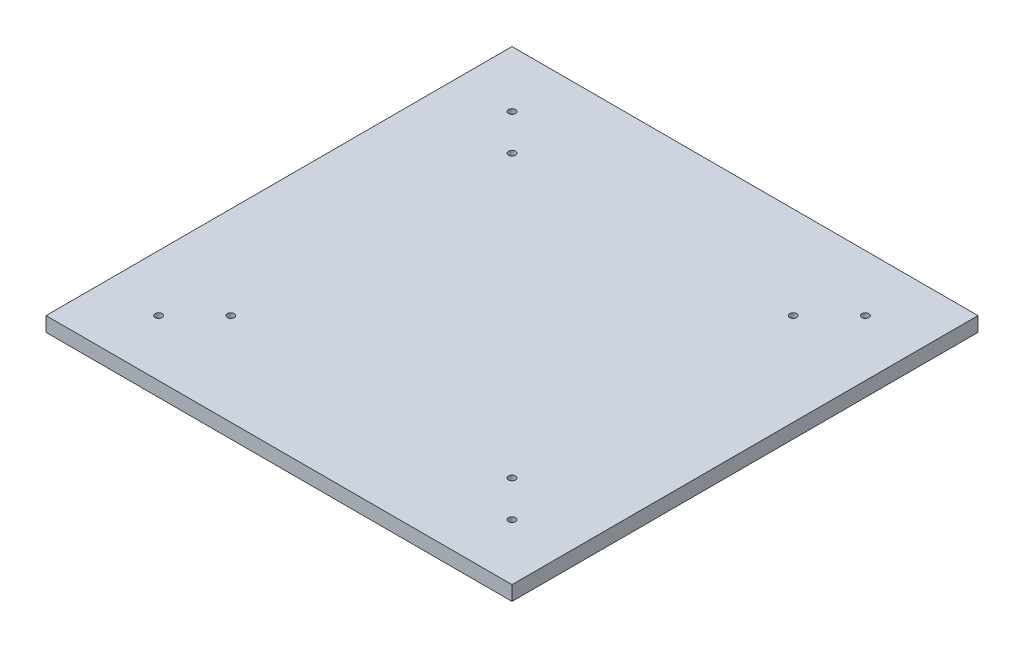
ISO-10303-21;
HEADER;
FILE_DESCRIPTION(('STEP AP214'),'2;1');
FILE_NAME('part.step','',(''),(''),'','','');
FILE_SCHEMA(('AUTOMOTIVE_DESIGN { 1 0 10303 214 1 1 1 1 }'));
ENDSEC;
DATA;
#1=APPLICATION_CONTEXT('core data for automotive mechanical design processes');
#2=APPLICATION_PROTOCOL_DEFINITION('international standard','automotive_design',2000,#1);
#3=PRODUCT_CONTEXT('',#1,'mechanical');
#4=PRODUCT('Part','Part','',(#3));
#5=PRODUCT_RELATED_PRODUCT_CATEGORY('part','',(#4));
#6=PRODUCT_DEFINITION_FORMATION('','',#4);
#7=PRODUCT_DEFINITION_CONTEXT('part definition',#1,'design');
#8=PRODUCT_DEFINITION('design','',#6,#7);
#9=PRODUCT_DEFINITION_SHAPE('','',#8);
#10=(LENGTH_UNIT() NAMED_UNIT(*) SI_UNIT(.MILLI.,.METRE.));
#11=(NAMED_UNIT(*) PLANE_ANGLE_UNIT() SI_UNIT($,.RADIAN.));
#12=(NAMED_UNIT(*) SI_UNIT($,.STERADIAN.) SOLID_ANGLE_UNIT());
#13=UNCERTAINTY_MEASURE_WITH_UNIT(LENGTH_MEASURE(1.E-05),#10,'distance_accuracy_value','');
#14=(GEOMETRIC_REPRESENTATION_CONTEXT(3) GLOBAL_UNCERTAINTY_ASSIGNED_CONTEXT((#13)) GLOBAL_UNIT_ASSIGNED_CONTEXT((#10,
#11,#12)) REPRESENTATION_CONTEXT('',''));
#15=CARTESIAN_POINT('',(0.,0.,0.));
#16=DIRECTION('',(0.,0.,1.));
#17=DIRECTION('',(1.,0.,0.));
#18=AXIS2_PLACEMENT_3D('',#15,#16,#17);
#19=CARTESIAN_POINT('',(0.,5.,0.));
#20=DIRECTION('',(0.,-1.,0.));
#21=DIRECTION('',(0.,0.,-1.));
#22=AXIS2_PLACEMENT_3D('',#19,#20,#21);
#23=PLANE('',#22);
#24=DIRECTION('',(0.,0.,-1.));
#25=VECTOR('',#24,1.);
#26=CARTESIAN_POINT('',(80.,5.,80.));
#27=LINE('',#26,#25);
#28=CARTESIAN_POINT('',(80.,5.,80.));
#29=VERTEX_POINT('',#28);
#30=CARTESIAN_POINT('',(80.,5.,-80.));
#31=VERTEX_POINT('',#30);
#32=EDGE_CURVE('E84',#29,#31,#27,.T.);
#33=ORIENTED_EDGE('',*,*,#32,.T.);
#34=DIRECTION('',(-1.,0.,0.));
#35=VECTOR('',#34,1.);
#36=CARTESIAN_POINT('',(-80.,5.,-80.));
#37=LINE('',#36,#35);
#38=CARTESIAN_POINT('',(-80.,5.,-80.));
#39=VERTEX_POINT('',#38);
#40=EDGE_CURVE('E79',#31,#39,#37,.T.);
#41=ORIENTED_EDGE('',*,*,#40,.T.);
#42=DIRECTION('',(0.,0.,1.));
#43=VECTOR('',#42,1.);
#44=CARTESIAN_POINT('',(-80.,5.,80.));
#45=LINE('',#44,#43);
#46=CARTESIAN_POINT('',(-80.,5.,80.));
#47=VERTEX_POINT('',#46);
#48=EDGE_CURVE('E82',#39,#47,#45,.T.);
#49=ORIENTED_EDGE('',*,*,#48,.T.);
#50=DIRECTION('',(1.,0.,0.));
#51=VECTOR('',#50,1.);
#52=CARTESIAN_POINT('',(-80.,5.,80.));
#53=LINE('',#52,#51);
#54=EDGE_CURVE('E49',#47,#29,#53,.T.);
#55=ORIENTED_EDGE('',*,*,#54,.T.);
#56=EDGE_LOOP('',(#33,#41,#49,#55));
#57=FACE_BOUND('',#56,.T.);
#58=CARTESIAN_POINT('',(-60.6642066420664,5.,-60.6642066420664));
#59=DIRECTION('',(0.,1.,0.));
#60=DIRECTION('',(0.,0.,1.));
#61=AXIS2_PLACEMENT_3D('',#58,#59,#60);
#62=CIRCLE('',#61,1.2);
#63=CARTESIAN_POINT('',(-60.6642066420664,5.,-59.4642066420664));
#64=VERTEX_POINT('',#63);
#65=EDGE_CURVE('E99',#64,#64,#62,.T.);
#66=ORIENTED_EDGE('',*,*,#65,.F.);
#67=EDGE_LOOP('',(#66));
#68=FACE_BOUND('',#67,.T.);
#69=CARTESIAN_POINT('',(-48.2795521345399,5.,-48.2795521345399));
#70=DIRECTION('',(0.,1.,0.));
#71=DIRECTION('',(0.,0.,1.));
#72=AXIS2_PLACEMENT_3D('',#69,#70,#71);
#73=CIRCLE('',#72,1.2);
#74=CARTESIAN_POINT('',(-48.2795521345399,5.,-47.0795521345399));
#75=VERTEX_POINT('',#74);
#76=EDGE_CURVE('E114',#75,#75,#73,.T.);
#77=ORIENTED_EDGE('',*,*,#76,.F.);
#78=EDGE_LOOP('',(#77));
#79=FACE_BOUND('',#78,.T.);
#80=CARTESIAN_POINT('',(48.2795521345399,5.,-48.2795521345399));
#81=DIRECTION('',(0.,1.,0.));
#82=DIRECTION('',(0.,0.,-1.));
#83=AXIS2_PLACEMENT_3D('',#80,#81,#82);
#84=CIRCLE('',#83,1.2);
#85=CARTESIAN_POINT('',(48.2795521345399,5.,-49.4795521345399));
#86=VERTEX_POINT('',#85);
#87=EDGE_CURVE('E120',#86,#86,#84,.T.);
#88=ORIENTED_EDGE('',*,*,#87,.F.);
#89=EDGE_LOOP('',(#88));
#90=FACE_BOUND('',#89,.T.);
#91=CARTESIAN_POINT('',(60.6642066420665,5.,-60.6642066420664));
#92=DIRECTION('',(0.,1.,0.));
#93=DIRECTION('',(0.,0.,-1.));
#94=AXIS2_PLACEMENT_3D('',#91,#92,#93);
#95=CIRCLE('',#94,1.2);
#96=CARTESIAN_POINT('',(60.6642066420665,5.,-61.8642066420664));
#97=VERTEX_POINT('',#96);
#98=EDGE_CURVE('E126',#97,#97,#95,.T.);
#99=ORIENTED_EDGE('',*,*,#98,.F.);
#100=EDGE_LOOP('',(#99));
#101=FACE_BOUND('',#100,.T.);
#102=CARTESIAN_POINT('',(60.6642066420665,5.,60.6642066420664));
#103=DIRECTION('',(0.,1.,0.));
#104=DIRECTION('',(0.,0.,1.));
#105=AXIS2_PLACEMENT_3D('',#102,#103,#104);
#106=CIRCLE('',#105,1.2);
#107=CARTESIAN_POINT('',(60.6642066420665,5.,61.8642066420664));
#108=VERTEX_POINT('',#107);
#109=EDGE_CURVE('E132',#108,#108,#106,.T.);
#110=ORIENTED_EDGE('',*,*,#109,.F.);
#111=EDGE_LOOP('',(#110));
#112=FACE_BOUND('',#111,.T.);
#113=CARTESIAN_POINT('',(48.2795521345399,5.,48.2795521345398));
#114=DIRECTION('',(0.,1.,0.));
#115=DIRECTION('',(0.,0.,1.));
#116=AXIS2_PLACEMENT_3D('',#113,#114,#115);
#117=CIRCLE('',#116,1.2);
#118=CARTESIAN_POINT('',(48.2795521345399,5.,49.4795521345398));
#119=VERTEX_POINT('',#118);
#120=EDGE_CURVE('E138',#119,#119,#117,.T.);
#121=ORIENTED_EDGE('',*,*,#120,.F.);
#122=EDGE_LOOP('',(#121));
#123=FACE_BOUND('',#122,.T.);
#124=CARTESIAN_POINT('',(-48.2795521345399,5.,48.2795521345399));
#125=DIRECTION('',(0.,1.,0.));
#126=DIRECTION('',(0.,0.,-1.));
#127=AXIS2_PLACEMENT_3D('',#124,#125,#126);
#128=CIRCLE('',#127,1.2);
#129=CARTESIAN_POINT('',(-48.2795521345399,5.,47.0795521345399));
#130=VERTEX_POINT('',#129);
#131=EDGE_CURVE('E144',#130,#130,#128,.T.);
#132=ORIENTED_EDGE('',*,*,#131,.F.);
#133=EDGE_LOOP('',(#132));
#134=FACE_BOUND('',#133,.T.);
#135=CARTESIAN_POINT('',(-60.6642066420664,5.,60.6642066420664));
#136=DIRECTION('',(0.,1.,0.));
#137=DIRECTION('',(0.,0.,-1.));
#138=AXIS2_PLACEMENT_3D('',#135,#136,#137);
#139=CIRCLE('',#138,1.2);
#140=CARTESIAN_POINT('',(-60.6642066420664,5.,59.4642066420664));
#141=VERTEX_POINT('',#140);
#142=EDGE_CURVE('E150',#141,#141,#139,.T.);
#143=ORIENTED_EDGE('',*,*,#142,.F.);
#144=EDGE_LOOP('',(#143));
#145=FACE_BOUND('',#144,.T.);
#146=ADVANCED_FACE('F32',(#57,#68,#79,#90,#101,#112,#123,#134,#145),#23,.F.);
#147=CARTESIAN_POINT('',(0.,0.,0.));
#148=DIRECTION('',(0.,-1.,0.));
#149=DIRECTION('',(0.,0.,-1.));
#150=AXIS2_PLACEMENT_3D('',#147,#148,#149);
#151=PLANE('',#150);
#152=CARTESIAN_POINT('',(-48.2795521345399,0.,48.2795521345399));
#153=DIRECTION('',(0.,1.,0.));
#154=DIRECTION('',(0.,0.,-1.));
#155=AXIS2_PLACEMENT_3D('',#152,#153,#154);
#156=CIRCLE('',#155,1.2);
#157=CARTESIAN_POINT('',(-48.2795521345399,0.,47.0795521345399));
#158=VERTEX_POINT('',#157);
#159=EDGE_CURVE('E147',#158,#158,#156,.T.);
#160=ORIENTED_EDGE('',*,*,#159,.T.);
#161=EDGE_LOOP('',(#160));
#162=FACE_BOUND('',#161,.T.);
#163=CARTESIAN_POINT('',(60.6642066420665,0.,60.6642066420664));
#164=DIRECTION('',(0.,1.,0.));
#165=DIRECTION('',(0.,0.,1.));
#166=AXIS2_PLACEMENT_3D('',#163,#164,#165);
#167=CIRCLE('',#166,1.2);
#168=CARTESIAN_POINT('',(60.6642066420665,0.,61.8642066420664));
#169=VERTEX_POINT('',#168);
#170=EDGE_CURVE('E135',#169,#169,#167,.T.);
#171=ORIENTED_EDGE('',*,*,#170,.T.);
#172=EDGE_LOOP('',(#171));
#173=FACE_BOUND('',#172,.T.);
#174=CARTESIAN_POINT('',(48.2795521345399,0.,-48.2795521345399));
#175=DIRECTION('',(0.,1.,0.));
#176=DIRECTION('',(0.,0.,-1.));
#177=AXIS2_PLACEMENT_3D('',#174,#175,#176);
#178=CIRCLE('',#177,1.2);
#179=CARTESIAN_POINT('',(48.2795521345399,0.,-49.4795521345399));
#180=VERTEX_POINT('',#179);
#181=EDGE_CURVE('E123',#180,#180,#178,.T.);
#182=ORIENTED_EDGE('',*,*,#181,.T.);
#183=EDGE_LOOP('',(#182));
#184=FACE_BOUND('',#183,.T.);
#185=CARTESIAN_POINT('',(-60.6642066420664,0.,-60.6642066420664));
#186=DIRECTION('',(0.,1.,0.));
#187=DIRECTION('',(0.,0.,1.));
#188=AXIS2_PLACEMENT_3D('',#185,#186,#187);
#189=CIRCLE('',#188,1.2);
#190=CARTESIAN_POINT('',(-60.6642066420664,0.,-59.4642066420664));
#191=VERTEX_POINT('',#190);
#192=EDGE_CURVE('E111',#191,#191,#189,.T.);
#193=ORIENTED_EDGE('',*,*,#192,.T.);
#194=EDGE_LOOP('',(#193));
#195=FACE_BOUND('',#194,.T.);
#196=DIRECTION('',(0.,0.,-1.));
#197=VECTOR('',#196,1.);
#198=CARTESIAN_POINT('',(80.,0.,80.));
#199=LINE('',#198,#197);
#200=CARTESIAN_POINT('',(80.,0.,80.));
#201=VERTEX_POINT('',#200);
#202=CARTESIAN_POINT('',(80.,0.,-80.));
#203=VERTEX_POINT('',#202);
#204=EDGE_CURVE('E96',#201,#203,#199,.T.);
#205=ORIENTED_EDGE('',*,*,#204,.F.);
#206=DIRECTION('',(1.,0.,0.));
#207=VECTOR('',#206,1.);
#208=CARTESIAN_POINT('',(-80.,0.,80.));
#209=LINE('',#208,#207);
#210=CARTESIAN_POINT('',(-80.,0.,80.));
#211=VERTEX_POINT('',#210);
#212=EDGE_CURVE('E72',#211,#201,#209,.T.);
#213=ORIENTED_EDGE('',*,*,#212,.F.);
#214=DIRECTION('',(0.,0.,1.));
#215=VECTOR('',#214,1.);
#216=CARTESIAN_POINT('',(-80.,0.,80.));
#217=LINE('',#216,#215);
#218=CARTESIAN_POINT('',(-80.,0.,-80.));
#219=VERTEX_POINT('',#218);
#220=EDGE_CURVE('E66',#219,#211,#217,.T.);
#221=ORIENTED_EDGE('',*,*,#220,.F.);
#222=DIRECTION('',(-1.,0.,0.));
#223=VECTOR('',#222,1.);
#224=CARTESIAN_POINT('',(-80.,0.,-80.));
#225=LINE('',#224,#223);
#226=EDGE_CURVE('E88',#203,#219,#225,.T.);
#227=ORIENTED_EDGE('',*,*,#226,.F.);
#228=EDGE_LOOP('',(#205,#213,#221,#227));
#229=FACE_BOUND('',#228,.T.);
#230=CARTESIAN_POINT('',(-48.2795521345399,0.,-48.2795521345399));
#231=DIRECTION('',(0.,1.,0.));
#232=DIRECTION('',(0.,0.,1.));
#233=AXIS2_PLACEMENT_3D('',#230,#231,#232);
#234=CIRCLE('',#233,1.2);
#235=CARTESIAN_POINT('',(-48.2795521345399,0.,-47.0795521345399));
#236=VERTEX_POINT('',#235);
#237=EDGE_CURVE('E117',#236,#236,#234,.T.);
#238=ORIENTED_EDGE('',*,*,#237,.T.);
#239=EDGE_LOOP('',(#238));
#240=FACE_BOUND('',#239,.T.);
#241=CARTESIAN_POINT('',(60.6642066420665,0.,-60.6642066420664));
#242=DIRECTION('',(0.,1.,0.));
#243=DIRECTION('',(0.,0.,-1.));
#244=AXIS2_PLACEMENT_3D('',#241,#242,#243);
#245=CIRCLE('',#244,1.2);
#246=CARTESIAN_POINT('',(60.6642066420665,0.,-61.8642066420664));
#247=VERTEX_POINT('',#246);
#248=EDGE_CURVE('E129',#247,#247,#245,.T.);
#249=ORIENTED_EDGE('',*,*,#248,.T.);
#250=EDGE_LOOP('',(#249));
#251=FACE_BOUND('',#250,.T.);
#252=CARTESIAN_POINT('',(48.2795521345399,0.,48.2795521345398));
#253=DIRECTION('',(0.,1.,0.));
#254=DIRECTION('',(0.,0.,1.));
#255=AXIS2_PLACEMENT_3D('',#252,#253,#254);
#256=CIRCLE('',#255,1.2);
#257=CARTESIAN_POINT('',(48.2795521345399,0.,49.4795521345398));
#258=VERTEX_POINT('',#257);
#259=EDGE_CURVE('E141',#258,#258,#256,.T.);
#260=ORIENTED_EDGE('',*,*,#259,.T.);
#261=EDGE_LOOP('',(#260));
#262=FACE_BOUND('',#261,.T.);
#263=CARTESIAN_POINT('',(-60.6642066420664,0.,60.6642066420664));
#264=DIRECTION('',(0.,1.,0.));
#265=DIRECTION('',(0.,0.,-1.));
#266=AXIS2_PLACEMENT_3D('',#263,#264,#265);
#267=CIRCLE('',#266,1.2);
#268=CARTESIAN_POINT('',(-60.6642066420664,0.,59.4642066420664));
#269=VERTEX_POINT('',#268);
#270=EDGE_CURVE('E153',#269,#269,#267,.T.);
#271=ORIENTED_EDGE('',*,*,#270,.T.);
#272=EDGE_LOOP('',(#271));
#273=FACE_BOUND('',#272,.T.);
#274=ADVANCED_FACE('F107',(#162,#173,#184,#195,#229,#240,#251,#262,#273),#151,.T.);
#275=CARTESIAN_POINT('',(80.,5.,80.));
#276=DIRECTION('',(-1.,0.,0.));
#277=DIRECTION('',(0.,0.,1.));
#278=AXIS2_PLACEMENT_3D('',#275,#276,#277);
#279=PLANE('',#278);
#280=ORIENTED_EDGE('',*,*,#204,.T.);
#281=DIRECTION('',(0.,-1.,0.));
#282=VECTOR('',#281,1.);
#283=CARTESIAN_POINT('',(80.,5.,-80.));
#284=LINE('',#283,#282);
#285=EDGE_CURVE('E11',#31,#203,#284,.T.);
#286=ORIENTED_EDGE('',*,*,#285,.F.);
#287=ORIENTED_EDGE('',*,*,#32,.F.);
#288=DIRECTION('',(0.,-1.,0.));
#289=VECTOR('',#288,1.);
#290=CARTESIAN_POINT('',(80.,5.,80.));
#291=LINE('',#290,#289);
#292=EDGE_CURVE('E92',#29,#201,#291,.T.);
#293=ORIENTED_EDGE('',*,*,#292,.T.);
#294=EDGE_LOOP('',(#280,#286,#287,#293));
#295=FACE_BOUND('',#294,.T.);
#296=ADVANCED_FACE('F34',(#295),#279,.F.);
#297=CARTESIAN_POINT('',(-80.,5.,-80.));
#298=DIRECTION('',(0.,0.,1.));
#299=DIRECTION('',(1.,0.,0.));
#300=AXIS2_PLACEMENT_3D('',#297,#298,#299);
#301=PLANE('',#300);
#302=ORIENTED_EDGE('',*,*,#226,.T.);
#303=DIRECTION('',(0.,-1.,0.));
#304=VECTOR('',#303,1.);
#305=CARTESIAN_POINT('',(-80.,5.,-80.));
#306=LINE('',#305,#304);
#307=EDGE_CURVE('E41',#39,#219,#306,.T.);
#308=ORIENTED_EDGE('',*,*,#307,.F.);
#309=ORIENTED_EDGE('',*,*,#40,.F.);
#310=ORIENTED_EDGE('',*,*,#285,.T.);
#311=EDGE_LOOP('',(#302,#308,#309,#310));
#312=FACE_BOUND('',#311,.T.);
#313=ADVANCED_FACE('F87',(#312),#301,.F.);
#314=CARTESIAN_POINT('',(-80.,5.,80.));
#315=DIRECTION('',(1.,0.,0.));
#316=DIRECTION('',(0.,0.,-1.));
#317=AXIS2_PLACEMENT_3D('',#314,#315,#316);
#318=PLANE('',#317);
#319=ORIENTED_EDGE('',*,*,#220,.T.);
#320=DIRECTION('',(0.,-1.,0.));
#321=VECTOR('',#320,1.);
#322=CARTESIAN_POINT('',(-80.,5.,80.));
#323=LINE('',#322,#321);
#324=EDGE_CURVE('E89',#47,#211,#323,.T.);
#325=ORIENTED_EDGE('',*,*,#324,.F.);
#326=ORIENTED_EDGE('',*,*,#48,.F.);
#327=ORIENTED_EDGE('',*,*,#307,.T.);
#328=EDGE_LOOP('',(#319,#325,#326,#327));
#329=FACE_BOUND('',#328,.T.);
#330=ADVANCED_FACE('F90',(#329),#318,.F.);
#331=CARTESIAN_POINT('',(-80.,5.,80.));
#332=DIRECTION('',(0.,0.,-1.));
#333=DIRECTION('',(-1.,0.,0.));
#334=AXIS2_PLACEMENT_3D('',#331,#332,#333);
#335=PLANE('',#334);
#336=ORIENTED_EDGE('',*,*,#212,.T.);
#337=ORIENTED_EDGE('',*,*,#292,.F.);
#338=ORIENTED_EDGE('',*,*,#54,.F.);
#339=ORIENTED_EDGE('',*,*,#324,.T.);
#340=EDGE_LOOP('',(#336,#337,#338,#339));
#341=FACE_BOUND('',#340,.T.);
#342=ADVANCED_FACE('F104',(#341),#335,.F.);
#343=CARTESIAN_POINT('',(-60.6642066420664,5.,-60.6642066420664));
#344=DIRECTION('',(0.,-1.,0.));
#345=DIRECTION('',(0.,0.,-1.));
#346=AXIS2_PLACEMENT_3D('',#343,#344,#345);
#347=CYLINDRICAL_SURFACE('',#346,1.2);
#348=ORIENTED_EDGE('',*,*,#65,.T.);
#349=EDGE_LOOP('',(#348));
#350=FACE_BOUND('',#349,.T.);
#351=ORIENTED_EDGE('',*,*,#192,.F.);
#352=EDGE_LOOP('',(#351));
#353=FACE_BOUND('',#352,.T.);
#354=ADVANCED_FACE('F170',(#350,#353),#347,.F.);
#355=CARTESIAN_POINT('',(-48.2795521345399,5.,-48.2795521345399));
#356=DIRECTION('',(0.,-1.,0.));
#357=DIRECTION('',(0.,0.,-1.));
#358=AXIS2_PLACEMENT_3D('',#355,#356,#357);
#359=CYLINDRICAL_SURFACE('',#358,1.2);
#360=ORIENTED_EDGE('',*,*,#76,.T.);
#361=EDGE_LOOP('',(#360));
#362=FACE_BOUND('',#361,.T.);
#363=ORIENTED_EDGE('',*,*,#237,.F.);
#364=EDGE_LOOP('',(#363));
#365=FACE_BOUND('',#364,.T.);
#366=ADVANCED_FACE('F216',(#362,#365),#359,.F.);
#367=CARTESIAN_POINT('',(48.2795521345399,5.,-48.2795521345399));
#368=DIRECTION('',(0.,-1.,0.));
#369=DIRECTION('',(0.,0.,-1.));
#370=AXIS2_PLACEMENT_3D('',#367,#368,#369);
#371=CYLINDRICAL_SURFACE('',#370,1.2);
#372=ORIENTED_EDGE('',*,*,#87,.T.);
#373=EDGE_LOOP('',(#372));
#374=FACE_BOUND('',#373,.T.);
#375=ORIENTED_EDGE('',*,*,#181,.F.);
#376=EDGE_LOOP('',(#375));
#377=FACE_BOUND('',#376,.T.);
#378=ADVANCED_FACE('F224',(#374,#377),#371,.F.);
#379=CARTESIAN_POINT('',(60.6642066420665,5.,-60.6642066420664));
#380=DIRECTION('',(0.,-1.,0.));
#381=DIRECTION('',(0.,0.,-1.));
#382=AXIS2_PLACEMENT_3D('',#379,#380,#381);
#383=CYLINDRICAL_SURFACE('',#382,1.2);
#384=ORIENTED_EDGE('',*,*,#98,.T.);
#385=EDGE_LOOP('',(#384));
#386=FACE_BOUND('',#385,.T.);
#387=ORIENTED_EDGE('',*,*,#248,.F.);
#388=EDGE_LOOP('',(#387));
#389=FACE_BOUND('',#388,.T.);
#390=ADVANCED_FACE('F232',(#386,#389),#383,.F.);
#391=CARTESIAN_POINT('',(60.6642066420665,5.,60.6642066420664));
#392=DIRECTION('',(0.,-1.,0.));
#393=DIRECTION('',(0.,0.,-1.));
#394=AXIS2_PLACEMENT_3D('',#391,#392,#393);
#395=CYLINDRICAL_SURFACE('',#394,1.2);
#396=ORIENTED_EDGE('',*,*,#109,.T.);
#397=EDGE_LOOP('',(#396));
#398=FACE_BOUND('',#397,.T.);
#399=ORIENTED_EDGE('',*,*,#170,.F.);
#400=EDGE_LOOP('',(#399));
#401=FACE_BOUND('',#400,.T.);
#402=ADVANCED_FACE('F241',(#398,#401),#395,.F.);
#403=CARTESIAN_POINT('',(48.2795521345399,5.,48.2795521345398));
#404=DIRECTION('',(0.,-1.,0.));
#405=DIRECTION('',(0.,0.,-1.));
#406=AXIS2_PLACEMENT_3D('',#403,#404,#405);
#407=CYLINDRICAL_SURFACE('',#406,1.2);
#408=ORIENTED_EDGE('',*,*,#120,.T.);
#409=EDGE_LOOP('',(#408));
#410=FACE_BOUND('',#409,.T.);
#411=ORIENTED_EDGE('',*,*,#259,.F.);
#412=EDGE_LOOP('',(#411));
#413=FACE_BOUND('',#412,.T.);
#414=ADVANCED_FACE('F250',(#410,#413),#407,.F.);
#415=CARTESIAN_POINT('',(-48.2795521345399,5.,48.2795521345399));
#416=DIRECTION('',(0.,-1.,0.));
#417=DIRECTION('',(0.,0.,-1.));
#418=AXIS2_PLACEMENT_3D('',#415,#416,#417);
#419=CYLINDRICAL_SURFACE('',#418,1.2);
#420=ORIENTED_EDGE('',*,*,#131,.T.);
#421=EDGE_LOOP('',(#420));
#422=FACE_BOUND('',#421,.T.);
#423=ORIENTED_EDGE('',*,*,#159,.F.);
#424=EDGE_LOOP('',(#423));
#425=FACE_BOUND('',#424,.T.);
#426=ADVANCED_FACE('F259',(#422,#425),#419,.F.);
#427=CARTESIAN_POINT('',(-60.6642066420664,5.,60.6642066420664));
#428=DIRECTION('',(0.,-1.,0.));
#429=DIRECTION('',(0.,0.,-1.));
#430=AXIS2_PLACEMENT_3D('',#427,#428,#429);
#431=CYLINDRICAL_SURFACE('',#430,1.2);
#432=ORIENTED_EDGE('',*,*,#142,.T.);
#433=EDGE_LOOP('',(#432));
#434=FACE_BOUND('',#433,.T.);
#435=ORIENTED_EDGE('',*,*,#270,.F.);
#436=EDGE_LOOP('',(#435));
#437=FACE_BOUND('',#436,.T.);
#438=ADVANCED_FACE('F159',(#434,#437),#431,.F.);
#439=CLOSED_SHELL('',(#146,#274,#296,#313,#330,#342,#354,#366,#378,#390,#402,#414,#426,#438));
#440=MANIFOLD_SOLID_BREP('B2',#439);
#441=ADVANCED_BREP_SHAPE_REPRESENTATION('',(#18,#440),#14);
#442=SHAPE_DEFINITION_REPRESENTATION(#9,#441);
ENDSEC;
END-ISO-10303-21;
